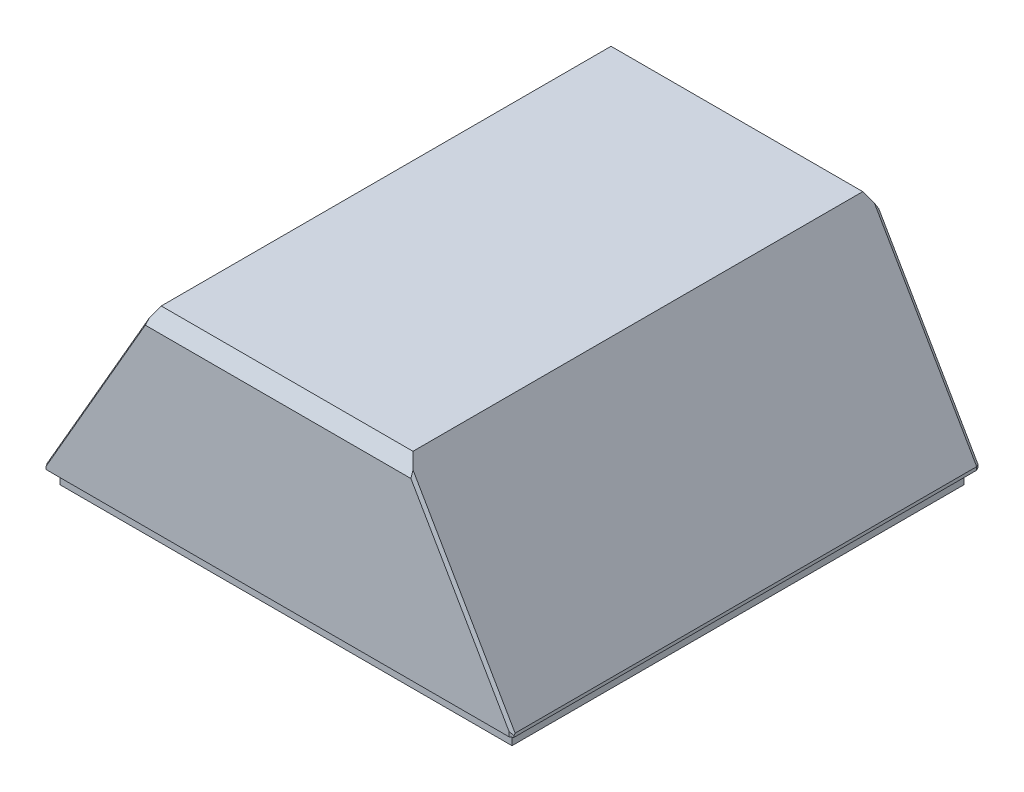
ISO-10303-21;
HEADER;
FILE_DESCRIPTION(('STEP AP214'),'2;1');
FILE_NAME('part.step','',(''),(''),'','','');
FILE_SCHEMA(('AUTOMOTIVE_DESIGN { 1 0 10303 214 1 1 1 1 }'));
ENDSEC;
DATA;
#1=APPLICATION_CONTEXT('core data for automotive mechanical design processes');
#2=APPLICATION_PROTOCOL_DEFINITION('international standard','automotive_design',2000,#1);
#3=PRODUCT_CONTEXT('',#1,'mechanical');
#4=PRODUCT('Part','Part','',(#3));
#5=PRODUCT_RELATED_PRODUCT_CATEGORY('part','',(#4));
#6=PRODUCT_DEFINITION_FORMATION('','',#4);
#7=PRODUCT_DEFINITION_CONTEXT('part definition',#1,'design');
#8=PRODUCT_DEFINITION('design','',#6,#7);
#9=PRODUCT_DEFINITION_SHAPE('','',#8);
#10=(LENGTH_UNIT() NAMED_UNIT(*) SI_UNIT(.MILLI.,.METRE.));
#11=(NAMED_UNIT(*) PLANE_ANGLE_UNIT() SI_UNIT($,.RADIAN.));
#12=(NAMED_UNIT(*) SI_UNIT($,.STERADIAN.) SOLID_ANGLE_UNIT());
#13=UNCERTAINTY_MEASURE_WITH_UNIT(LENGTH_MEASURE(1.E-05),#10,'distance_accuracy_value','');
#14=(GEOMETRIC_REPRESENTATION_CONTEXT(3) GLOBAL_UNCERTAINTY_ASSIGNED_CONTEXT((#13)) GLOBAL_UNIT_ASSIGNED_CONTEXT((#10,
#11,#12)) REPRESENTATION_CONTEXT('',''));
#15=CARTESIAN_POINT('',(0.,0.,0.));
#16=DIRECTION('',(0.,0.,1.));
#17=DIRECTION('',(1.,0.,0.));
#18=AXIS2_PLACEMENT_3D('',#15,#16,#17);
#19=CARTESIAN_POINT('',(75.,1.,75.));
#20=DIRECTION('',(-1.,0.,0.));
#21=DIRECTION('',(0.,0.,1.));
#22=AXIS2_PLACEMENT_3D('',#19,#20,#21);
#23=PLANE('',#22);
#24=DIRECTION('',(0.,0.,1.));
#25=VECTOR('',#24,1.);
#26=CARTESIAN_POINT('',(75.,0.999999999999585,75.));
#27=LINE('',#26,#25);
#28=CARTESIAN_POINT('',(75.,0.999999999999585,-74.));
#29=VERTEX_POINT('',#28);
#30=CARTESIAN_POINT('',(75.,0.999999999999585,74.));
#31=VERTEX_POINT('',#30);
#32=EDGE_CURVE('E223',#29,#31,#27,.T.);
#33=ORIENTED_EDGE('',*,*,#32,.T.);
#34=DIRECTION('',(0.,0.755928946018454,-0.654653670707978));
#35=VECTOR('',#34,1.);
#36=CARTESIAN_POINT('',(75.,37.4555455688303,42.4285714285714));
#37=LINE('',#36,#35);
#38=CARTESIAN_POINT('',(75.,0.511966128287018,74.4226497308104));
#39=VERTEX_POINT('',#38);
#40=EDGE_CURVE('E350',#31,#39,#37,.F.);
#41=ORIENTED_EDGE('',*,*,#40,.T.);
#42=DIRECTION('',(0.,-1.,0.));
#43=VECTOR('',#42,1.);
#44=CARTESIAN_POINT('',(75.,1.,74.4226497308104));
#45=LINE('',#44,#43);
#46=CARTESIAN_POINT('',(75.,0.,74.4226497308104));
#47=VERTEX_POINT('',#46);
#48=EDGE_CURVE('E294',#39,#47,#45,.T.);
#49=ORIENTED_EDGE('',*,*,#48,.T.);
#50=DIRECTION('',(0.,0.,-1.));
#51=VECTOR('',#50,1.);
#52=CARTESIAN_POINT('',(75.,0.,75.));
#53=LINE('',#52,#51);
#54=CARTESIAN_POINT('',(75.,0.,-74.));
#55=VERTEX_POINT('',#54);
#56=EDGE_CURVE('E193',#47,#55,#53,.T.);
#57=ORIENTED_EDGE('',*,*,#56,.T.);
#58=DIRECTION('',(0.,1.,0.));
#59=VECTOR('',#58,1.);
#60=CARTESIAN_POINT('',(75.,1.,-74.));
#61=LINE('',#60,#59);
#62=EDGE_CURVE('E297',#55,#29,#61,.T.);
#63=ORIENTED_EDGE('',*,*,#62,.T.);
#64=EDGE_LOOP('',(#33,#41,#49,#57,#63));
#65=FACE_BOUND('',#64,.T.);
#66=ADVANCED_FACE('F39',(#65),#23,.F.);
#67=CARTESIAN_POINT('',(-75.,1.,-75.));
#68=DIRECTION('',(0.,0.,1.));
#69=DIRECTION('',(1.,0.,0.));
#70=AXIS2_PLACEMENT_3D('',#67,#68,#69);
#71=PLANE('',#70);
#72=DIRECTION('',(0.,1.,0.));
#73=VECTOR('',#72,1.);
#74=CARTESIAN_POINT('',(-74.,1.,-75.));
#75=LINE('',#74,#73);
#76=CARTESIAN_POINT('',(-74.,0.,-75.));
#77=VERTEX_POINT('',#76);
#78=CARTESIAN_POINT('',(-74.,1.57735026918919,-75.));
#79=VERTEX_POINT('',#78);
#80=EDGE_CURVE('E290',#77,#79,#75,.T.);
#81=ORIENTED_EDGE('',*,*,#80,.T.);
#82=DIRECTION('',(0.499999999999998,0.86602540378444,0.));
#83=VECTOR('',#82,1.);
#84=CARTESIAN_POINT('',(-42.7457351945705,55.7113248654052,-75.));
#85=LINE('',#84,#83);
#86=CARTESIAN_POINT('',(-42.5790685279039,56.,-75.));
#87=VERTEX_POINT('',#86);
#88=EDGE_CURVE('E305',#79,#87,#85,.T.);
#89=ORIENTED_EDGE('',*,*,#88,.T.);
#90=DIRECTION('',(1.,0.,0.));
#91=VECTOR('',#90,1.);
#92=CARTESIAN_POINT('',(-75.,56.,-75.));
#93=LINE('',#92,#91);
#94=CARTESIAN_POINT('',(42.5790685279039,56.,-75.));
#95=VERTEX_POINT('',#94);
#96=EDGE_CURVE('E246',#87,#95,#93,.T.);
#97=ORIENTED_EDGE('',*,*,#96,.T.);
#98=DIRECTION('',(0.499999999999998,-0.86602540378444,0.));
#99=VECTOR('',#98,1.);
#100=CARTESIAN_POINT('',(73.9226497308104,1.71132486540478,-75.));
#101=LINE('',#100,#99);
#102=CARTESIAN_POINT('',(74.4226497308104,0.845299461620388,-75.));
#103=VERTEX_POINT('',#102);
#104=EDGE_CURVE('E301',#95,#103,#101,.T.);
#105=ORIENTED_EDGE('',*,*,#104,.T.);
#106=DIRECTION('',(0.,-1.,0.));
#107=VECTOR('',#106,1.);
#108=CARTESIAN_POINT('',(74.4226497308104,1.,-75.));
#109=LINE('',#108,#107);
#110=CARTESIAN_POINT('',(74.4226497308104,0.,-75.));
#111=VERTEX_POINT('',#110);
#112=EDGE_CURVE('E287',#103,#111,#109,.T.);
#113=ORIENTED_EDGE('',*,*,#112,.T.);
#114=DIRECTION('',(-1.,0.,0.));
#115=VECTOR('',#114,1.);
#116=CARTESIAN_POINT('',(-75.,0.,-75.));
#117=LINE('',#116,#115);
#118=EDGE_CURVE('E198',#111,#77,#117,.T.);
#119=ORIENTED_EDGE('',*,*,#118,.T.);
#120=EDGE_LOOP('',(#81,#89,#97,#105,#113,#119));
#121=FACE_BOUND('',#120,.T.);
#122=ADVANCED_FACE('F422',(#121),#71,.F.);
#123=CARTESIAN_POINT('',(-75.,1.,75.));
#124=DIRECTION('',(1.,0.,0.));
#125=DIRECTION('',(0.,0.,-1.));
#126=AXIS2_PLACEMENT_3D('',#123,#124,#125);
#127=PLANE('',#126);
#128=DIRECTION('',(0.,0.,-1.));
#129=VECTOR('',#128,1.);
#130=CARTESIAN_POINT('',(-75.,0.999999999999585,75.));
#131=LINE('',#130,#129);
#132=CARTESIAN_POINT('',(-75.,0.999999999999585,74.));
#133=VERTEX_POINT('',#132);
#134=CARTESIAN_POINT('',(-75.,0.999999999999585,-74.));
#135=VERTEX_POINT('',#134);
#136=EDGE_CURVE('E227',#133,#135,#131,.T.);
#137=ORIENTED_EDGE('',*,*,#136,.T.);
#138=DIRECTION('',(0.,0.755928946018463,0.654653670707967));
#139=VECTOR('',#138,1.);
#140=CARTESIAN_POINT('',(-75.,0.340171120925897,-74.5714285714284));
#141=LINE('',#140,#139);
#142=CARTESIAN_POINT('',(-75.,0.511966128286974,-74.4226497308104));
#143=VERTEX_POINT('',#142);
#144=EDGE_CURVE('E321',#135,#143,#141,.F.);
#145=ORIENTED_EDGE('',*,*,#144,.T.);
#146=DIRECTION('',(0.,-1.,0.));
#147=VECTOR('',#146,1.);
#148=CARTESIAN_POINT('',(-75.,1.,-74.4226497308104));
#149=LINE('',#148,#147);
#150=CARTESIAN_POINT('',(-75.,0.,-74.4226497308104));
#151=VERTEX_POINT('',#150);
#152=EDGE_CURVE('E280',#143,#151,#149,.T.);
#153=ORIENTED_EDGE('',*,*,#152,.T.);
#154=DIRECTION('',(0.,0.,1.));
#155=VECTOR('',#154,1.);
#156=CARTESIAN_POINT('',(-75.,0.,75.));
#157=LINE('',#156,#155);
#158=CARTESIAN_POINT('',(-75.,0.,74.));
#159=VERTEX_POINT('',#158);
#160=EDGE_CURVE('E207',#151,#159,#157,.T.);
#161=ORIENTED_EDGE('',*,*,#160,.T.);
#162=DIRECTION('',(0.,1.,0.));
#163=VECTOR('',#162,1.);
#164=CARTESIAN_POINT('',(-75.,1.,74.));
#165=LINE('',#164,#163);
#166=EDGE_CURVE('E283',#159,#133,#165,.T.);
#167=ORIENTED_EDGE('',*,*,#166,.T.);
#168=EDGE_LOOP('',(#137,#145,#153,#161,#167));
#169=FACE_BOUND('',#168,.T.);
#170=ADVANCED_FACE('F395',(#169),#127,.F.);
#171=CARTESIAN_POINT('',(-75.,1.,75.));
#172=DIRECTION('',(0.,0.,-1.));
#173=DIRECTION('',(-1.,0.,0.));
#174=AXIS2_PLACEMENT_3D('',#171,#172,#173);
#175=PLANE('',#174);
#176=DIRECTION('',(0.,1.,0.));
#177=VECTOR('',#176,1.);
#178=CARTESIAN_POINT('',(74.,1.,75.));
#179=LINE('',#178,#177);
#180=CARTESIAN_POINT('',(74.,0.,75.));
#181=VERTEX_POINT('',#180);
#182=CARTESIAN_POINT('',(74.,1.57735026918923,75.));
#183=VERTEX_POINT('',#182);
#184=EDGE_CURVE('E261',#181,#183,#179,.T.);
#185=ORIENTED_EDGE('',*,*,#184,.T.);
#186=DIRECTION('',(-0.499999999999998,0.86602540378444,0.));
#187=VECTOR('',#186,1.);
#188=CARTESIAN_POINT('',(42.7457351945705,55.7113248654052,75.));
#189=LINE('',#188,#187);
#190=CARTESIAN_POINT('',(42.5790685279039,56.,75.));
#191=VERTEX_POINT('',#190);
#192=EDGE_CURVE('E340',#183,#191,#189,.T.);
#193=ORIENTED_EDGE('',*,*,#192,.T.);
#194=DIRECTION('',(-1.,0.,0.));
#195=VECTOR('',#194,1.);
#196=CARTESIAN_POINT('',(-75.,56.,75.));
#197=LINE('',#196,#195);
#198=CARTESIAN_POINT('',(-42.5790685279039,56.,75.));
#199=VERTEX_POINT('',#198);
#200=EDGE_CURVE('E257',#191,#199,#197,.T.);
#201=ORIENTED_EDGE('',*,*,#200,.T.);
#202=DIRECTION('',(-0.499999999999998,-0.86602540378444,0.));
#203=VECTOR('',#202,1.);
#204=CARTESIAN_POINT('',(-73.9226497308104,1.71132486540479,75.));
#205=LINE('',#204,#203);
#206=CARTESIAN_POINT('',(-74.4226497308104,0.845299461620343,75.));
#207=VERTEX_POINT('',#206);
#208=EDGE_CURVE('E336',#199,#207,#205,.T.);
#209=ORIENTED_EDGE('',*,*,#208,.T.);
#210=DIRECTION('',(0.,-1.,0.));
#211=VECTOR('',#210,1.);
#212=CARTESIAN_POINT('',(-74.4226497308104,1.,75.));
#213=LINE('',#212,#211);
#214=CARTESIAN_POINT('',(-74.4226497308104,0.,75.));
#215=VERTEX_POINT('',#214);
#216=EDGE_CURVE('E265',#207,#215,#213,.T.);
#217=ORIENTED_EDGE('',*,*,#216,.T.);
#218=DIRECTION('',(1.,0.,0.));
#219=VECTOR('',#218,1.);
#220=CARTESIAN_POINT('',(-75.,0.,75.));
#221=LINE('',#220,#219);
#222=EDGE_CURVE('E211',#215,#181,#221,.T.);
#223=ORIENTED_EDGE('',*,*,#222,.T.);
#224=EDGE_LOOP('',(#185,#193,#201,#209,#217,#223));
#225=FACE_BOUND('',#224,.T.);
#226=ADVANCED_FACE('F363',(#225),#175,.F.);
#227=CARTESIAN_POINT('',(0.,0.,0.));
#228=DIRECTION('',(0.,-1.,0.));
#229=DIRECTION('',(0.,0.,-1.));
#230=AXIS2_PLACEMENT_3D('',#227,#228,#229);
#231=PLANE('',#230);
#232=DIRECTION('',(0.,0.,1.));
#233=VECTOR('',#232,1.);
#234=CARTESIAN_POINT('',(72.5,0.,-72.5));
#235=LINE('',#234,#233);
#236=CARTESIAN_POINT('',(72.5,0.,-72.5));
#237=VERTEX_POINT('',#236);
#238=CARTESIAN_POINT('',(72.5,0.,72.5));
#239=VERTEX_POINT('',#238);
#240=EDGE_CURVE('E55',#237,#239,#235,.T.);
#241=ORIENTED_EDGE('',*,*,#240,.F.);
#242=DIRECTION('',(1.,0.,0.));
#243=VECTOR('',#242,1.);
#244=CARTESIAN_POINT('',(-72.5,0.,-72.5));
#245=LINE('',#244,#243);
#246=CARTESIAN_POINT('',(-72.5,0.,-72.5));
#247=VERTEX_POINT('',#246);
#248=EDGE_CURVE('E59',#247,#237,#245,.T.);
#249=ORIENTED_EDGE('',*,*,#248,.F.);
#250=DIRECTION('',(0.,0.,-1.));
#251=VECTOR('',#250,1.);
#252=CARTESIAN_POINT('',(-72.5,0.,-72.5));
#253=LINE('',#252,#251);
#254=CARTESIAN_POINT('',(-72.5,0.,72.5));
#255=VERTEX_POINT('',#254);
#256=EDGE_CURVE('E629',#255,#247,#253,.T.);
#257=ORIENTED_EDGE('',*,*,#256,.F.);
#258=DIRECTION('',(-1.,0.,0.));
#259=VECTOR('',#258,1.);
#260=CARTESIAN_POINT('',(-72.5,0.,72.5));
#261=LINE('',#260,#259);
#262=EDGE_CURVE('E639',#239,#255,#261,.T.);
#263=ORIENTED_EDGE('',*,*,#262,.F.);
#264=EDGE_LOOP('',(#241,#249,#257,#263));
#265=FACE_BOUND('',#264,.T.);
#266=ORIENTED_EDGE('',*,*,#222,.F.);
#267=DIRECTION('',(0.500000000000005,0.,0.866025403784436));
#268=VECTOR('',#267,1.);
#269=CARTESIAN_POINT('',(-88.2929399400241,0.,50.975952641917));
#270=LINE('',#269,#268);
#271=EDGE_CURVE('E277',#215,#159,#270,.F.);
#272=ORIENTED_EDGE('',*,*,#271,.T.);
#273=ORIENTED_EDGE('',*,*,#160,.F.);
#274=DIRECTION('',(-0.866025403784441,0.,0.499999999999996));
#275=VECTOR('',#274,1.);
#276=CARTESIAN_POINT('',(-50.9759526419159,0.,-88.2929399400244));
#277=LINE('',#276,#275);
#278=EDGE_CURVE('E274',#151,#77,#277,.F.);
#279=ORIENTED_EDGE('',*,*,#278,.T.);
#280=ORIENTED_EDGE('',*,*,#118,.F.);
#281=DIRECTION('',(-0.499999999999996,0.,-0.866025403784441));
#282=VECTOR('',#281,1.);
#283=CARTESIAN_POINT('',(88.2929399400244,0.,-50.9759526419159));
#284=LINE('',#283,#282);
#285=EDGE_CURVE('E271',#111,#55,#284,.F.);
#286=ORIENTED_EDGE('',*,*,#285,.T.);
#287=ORIENTED_EDGE('',*,*,#56,.F.);
#288=DIRECTION('',(0.866025403784436,0.,-0.500000000000005));
#289=VECTOR('',#288,1.);
#290=CARTESIAN_POINT('',(50.975952641917,0.,88.2929399400241));
#291=LINE('',#290,#289);
#292=EDGE_CURVE('E268',#47,#181,#291,.F.);
#293=ORIENTED_EDGE('',*,*,#292,.T.);
#294=EDGE_LOOP('',(#266,#272,#273,#279,#280,#286,#287,#293));
#295=FACE_BOUND('',#294,.T.);
#296=ADVANCED_FACE('F403',(#265,#295),#231,.T.);
#297=CARTESIAN_POINT('',(0.,61.,0.));
#298=DIRECTION('',(0.,-1.,0.));
#299=DIRECTION('',(0.,0.,-1.));
#300=AXIS2_PLACEMENT_3D('',#297,#298,#299);
#301=PLANE('',#300);
#302=DIRECTION('',(0.,0.,-1.));
#303=VECTOR('',#302,1.);
#304=CARTESIAN_POINT('',(40.3589838486224,61.,0.));
#305=LINE('',#304,#303);
#306=CARTESIAN_POINT('',(40.3589838486224,61.,72.1132486540519));
#307=VERTEX_POINT('',#306);
#308=CARTESIAN_POINT('',(40.3589838486224,61.,-72.1132486540519));
#309=VERTEX_POINT('',#308);
#310=EDGE_CURVE('E219',#307,#309,#305,.T.);
#311=ORIENTED_EDGE('',*,*,#310,.T.);
#312=DIRECTION('',(-1.,0.,0.));
#313=VECTOR('',#312,1.);
#314=CARTESIAN_POINT('',(0.,61.,-72.1132486540519));
#315=LINE('',#314,#313);
#316=CARTESIAN_POINT('',(-40.3589838486224,61.,-72.1132486540519));
#317=VERTEX_POINT('',#316);
#318=EDGE_CURVE('E235',#309,#317,#315,.T.);
#319=ORIENTED_EDGE('',*,*,#318,.T.);
#320=DIRECTION('',(0.,0.,1.));
#321=VECTOR('',#320,1.);
#322=CARTESIAN_POINT('',(-40.3589838486224,61.,0.));
#323=LINE('',#322,#321);
#324=CARTESIAN_POINT('',(-40.3589838486224,61.,72.1132486540519));
#325=VERTEX_POINT('',#324);
#326=EDGE_CURVE('E215',#317,#325,#323,.T.);
#327=ORIENTED_EDGE('',*,*,#326,.T.);
#328=DIRECTION('',(1.,0.,0.));
#329=VECTOR('',#328,1.);
#330=CARTESIAN_POINT('',(0.,61.,72.1132486540519));
#331=LINE('',#330,#329);
#332=EDGE_CURVE('E231',#325,#307,#331,.T.);
#333=ORIENTED_EDGE('',*,*,#332,.T.);
#334=EDGE_LOOP('',(#311,#319,#327,#333));
#335=FACE_BOUND('',#334,.T.);
#336=ADVANCED_FACE('F378',(#335),#301,.F.);
#337=CARTESIAN_POINT('',(40.3589838486224,61.,0.));
#338=DIRECTION('',(-0.86602540378444,-0.499999999999998,0.));
#339=DIRECTION('',(0.,0.,-1.));
#340=AXIS2_PLACEMENT_3D('',#337,#338,#339);
#341=PLANE('',#340);
#342=ORIENTED_EDGE('',*,*,#32,.F.);
#343=DIRECTION('',(0.499999999999998,-0.86602540378444,0.));
#344=VECTOR('',#343,1.);
#345=CARTESIAN_POINT('',(43.2457351945705,56.,-74.0000000000001));
#346=LINE('',#345,#344);
#347=CARTESIAN_POINT('',(42.2457351945706,57.7320508075687,-74.0000000000001));
#348=VERTEX_POINT('',#347);
#349=EDGE_CURVE('E333',#29,#348,#346,.F.);
#350=ORIENTED_EDGE('',*,*,#349,.T.);
#351=DIRECTION('',(-0.447213595499956,0.774596669241485,0.447213595499957));
#352=VECTOR('',#351,1.);
#353=CARTESIAN_POINT('',(25.9363341178121,85.9807621135332,-57.6905989232415));
#354=LINE('',#353,#352);
#355=EDGE_CURVE('E254',#348,#309,#354,.T.);
#356=ORIENTED_EDGE('',*,*,#355,.T.);
#357=ORIENTED_EDGE('',*,*,#310,.F.);
#358=DIRECTION('',(0.447213595499956,-0.774596669241485,0.447213595499957));
#359=VECTOR('',#358,1.);
#360=CARTESIAN_POINT('',(25.9363341178121,85.9807621135332,57.6905989232415));
#361=LINE('',#360,#359);
#362=CARTESIAN_POINT('',(42.2457351945706,57.7320508075688,74.));
#363=VERTEX_POINT('',#362);
#364=EDGE_CURVE('E250',#307,#363,#361,.T.);
#365=ORIENTED_EDGE('',*,*,#364,.T.);
#366=DIRECTION('',(-0.499999999999998,0.86602540378444,0.));
#367=VECTOR('',#366,1.);
#368=CARTESIAN_POINT('',(74.,2.73205080756846,74.));
#369=LINE('',#368,#367);
#370=EDGE_CURVE('E330',#363,#31,#369,.F.);
#371=ORIENTED_EDGE('',*,*,#370,.T.);
#372=EDGE_LOOP('',(#342,#350,#356,#357,#365,#371));
#373=FACE_BOUND('',#372,.T.);
#374=ADVANCED_FACE('F374',(#373),#341,.F.);
#375=CARTESIAN_POINT('',(-40.3589838486224,61.,0.));
#376=DIRECTION('',(0.86602540378444,-0.499999999999998,0.));
#377=DIRECTION('',(0.,0.,1.));
#378=AXIS2_PLACEMENT_3D('',#375,#376,#377);
#379=PLANE('',#378);
#380=DIRECTION('',(-0.447213595499956,-0.774596669241485,-0.447213595499957));
#381=VECTOR('',#380,1.);
#382=CARTESIAN_POINT('',(-25.9363341178121,85.9807621135332,-57.6905989232415));
#383=LINE('',#382,#381);
#384=CARTESIAN_POINT('',(-42.2457351945706,57.7320508075688,-74.));
#385=VERTEX_POINT('',#384);
#386=EDGE_CURVE('E242',#317,#385,#383,.T.);
#387=ORIENTED_EDGE('',*,*,#386,.T.);
#388=DIRECTION('',(0.499999999999998,0.86602540378444,0.));
#389=VECTOR('',#388,1.);
#390=CARTESIAN_POINT('',(-74.,2.73205080756846,-74.));
#391=LINE('',#390,#389);
#392=EDGE_CURVE('E318',#385,#135,#391,.F.);
#393=ORIENTED_EDGE('',*,*,#392,.T.);
#394=ORIENTED_EDGE('',*,*,#136,.F.);
#395=DIRECTION('',(-0.499999999999998,-0.86602540378444,0.));
#396=VECTOR('',#395,1.);
#397=CARTESIAN_POINT('',(-43.2457351945705,56.,74.));
#398=LINE('',#397,#396);
#399=CARTESIAN_POINT('',(-42.2457351945705,57.7320508075689,74.));
#400=VERTEX_POINT('',#399);
#401=EDGE_CURVE('E315',#133,#400,#398,.F.);
#402=ORIENTED_EDGE('',*,*,#401,.T.);
#403=DIRECTION('',(0.447213595499956,0.774596669241485,-0.447213595499957));
#404=VECTOR('',#403,1.);
#405=CARTESIAN_POINT('',(-25.9363341178121,85.9807621135332,57.6905989232415));
#406=LINE('',#405,#404);
#407=EDGE_CURVE('E239',#400,#325,#406,.T.);
#408=ORIENTED_EDGE('',*,*,#407,.T.);
#409=ORIENTED_EDGE('',*,*,#326,.F.);
#410=EDGE_LOOP('',(#387,#393,#394,#402,#408,#409));
#411=FACE_BOUND('',#410,.T.);
#412=ADVANCED_FACE('F386',(#411),#379,.F.);
#413=CARTESIAN_POINT('',(0.,61.,-72.1132486540519));
#414=DIRECTION('',(0.,-0.499999999999999,0.866025403784439));
#415=DIRECTION('',(-1.,0.,0.));
#416=AXIS2_PLACEMENT_3D('',#413,#414,#415);
#417=PLANE('',#416);
#418=ORIENTED_EDGE('',*,*,#96,.F.);
#419=DIRECTION('',(0.164398987305349,0.854242196177251,0.493196961916071));
#420=VECTOR('',#419,1.);
#421=CARTESIAN_POINT('',(-40.4920392122478,66.8445224348067,-68.7389120530314));
#422=LINE('',#421,#420);
#423=EDGE_CURVE('E312',#87,#385,#422,.T.);
#424=ORIENTED_EDGE('',*,*,#423,.T.);
#425=ORIENTED_EDGE('',*,*,#386,.F.);
#426=ORIENTED_EDGE('',*,*,#318,.F.);
#427=ORIENTED_EDGE('',*,*,#355,.F.);
#428=DIRECTION('',(0.164398987305351,-0.854242196177251,-0.493196961916071));
#429=VECTOR('',#428,1.);
#430=CARTESIAN_POINT('',(40.4920392122478,66.8445224348068,-68.7389120530314));
#431=LINE('',#430,#429);
#432=EDGE_CURVE('E309',#348,#95,#431,.T.);
#433=ORIENTED_EDGE('',*,*,#432,.T.);
#434=EDGE_LOOP('',(#418,#424,#425,#426,#427,#433));
#435=FACE_BOUND('',#434,.T.);
#436=ADVANCED_FACE('F382',(#435),#417,.F.);
#437=CARTESIAN_POINT('',(0.,61.,72.1132486540519));
#438=DIRECTION('',(0.,-0.499999999999999,-0.866025403784439));
#439=DIRECTION('',(1.,0.,0.));
#440=AXIS2_PLACEMENT_3D('',#437,#438,#439);
#441=PLANE('',#440);
#442=ORIENTED_EDGE('',*,*,#200,.F.);
#443=DIRECTION('',(-0.164398987305358,0.85424219617725,-0.493196961916071));
#444=VECTOR('',#443,1.);
#445=CARTESIAN_POINT('',(40.4920392122476,66.844522434807,68.7389120530312));
#446=LINE('',#445,#444);
#447=EDGE_CURVE('E347',#191,#363,#446,.T.);
#448=ORIENTED_EDGE('',*,*,#447,.T.);
#449=ORIENTED_EDGE('',*,*,#364,.F.);
#450=ORIENTED_EDGE('',*,*,#332,.F.);
#451=ORIENTED_EDGE('',*,*,#407,.F.);
#452=DIRECTION('',(-0.164398987305356,-0.85424219617725,0.493196961916071));
#453=VECTOR('',#452,1.);
#454=CARTESIAN_POINT('',(-40.4920392122476,66.844522434807,68.7389120530312));
#455=LINE('',#454,#453);
#456=EDGE_CURVE('E344',#400,#199,#455,.T.);
#457=ORIENTED_EDGE('',*,*,#456,.T.);
#458=EDGE_LOOP('',(#442,#448,#449,#450,#451,#457));
#459=FACE_BOUND('',#458,.T.);
#460=ADVANCED_FACE('F369',(#459),#441,.F.);
#461=CARTESIAN_POINT('',(-74.4226497308104,1.,75.));
#462=DIRECTION('',(0.866025403784436,0.,-0.500000000000004));
#463=DIRECTION('',(0.,-1.,0.));
#464=AXIS2_PLACEMENT_3D('',#461,#462,#463);
#465=PLANE('',#464);
#466=ORIENTED_EDGE('',*,*,#216,.F.);
#467=DIRECTION('',(-0.495572219835084,0.132788176096097,-0.858356263574047));
#468=VECTOR('',#467,1.);
#469=CARTESIAN_POINT('',(-74.432829974735,0.84802724975871,74.982367300289));
#470=LINE('',#469,#468);
#471=EDGE_CURVE('E11',#207,#133,#470,.T.);
#472=ORIENTED_EDGE('',*,*,#471,.T.);
#473=ORIENTED_EDGE('',*,*,#166,.F.);
#474=ORIENTED_EDGE('',*,*,#271,.F.);
#475=EDGE_LOOP('',(#466,#472,#473,#474));
#476=FACE_BOUND('',#475,.T.);
#477=ADVANCED_FACE('F408',(#476),#465,.F.);
#478=CARTESIAN_POINT('',(-75.,1.,-74.4226497308104));
#479=DIRECTION('',(0.499999999999996,0.,0.866025403784441));
#480=DIRECTION('',(0.,-1.,0.));
#481=AXIS2_PLACEMENT_3D('',#478,#479,#480);
#482=PLANE('',#481);
#483=ORIENTED_EDGE('',*,*,#152,.F.);
#484=DIRECTION('',(0.636493951193922,0.67811056138219,-0.367479954059375));
#485=VECTOR('',#484,1.);
#486=CARTESIAN_POINT('',(-74.7893581044856,0.736380663177545,-74.5442638858882));
#487=LINE('',#486,#485);
#488=EDGE_CURVE('E324',#143,#79,#487,.T.);
#489=ORIENTED_EDGE('',*,*,#488,.T.);
#490=ORIENTED_EDGE('',*,*,#80,.F.);
#491=ORIENTED_EDGE('',*,*,#278,.F.);
#492=EDGE_LOOP('',(#483,#489,#490,#491));
#493=FACE_BOUND('',#492,.T.);
#494=ADVANCED_FACE('F398',(#493),#482,.F.);
#495=CARTESIAN_POINT('',(74.4226497308104,1.,-75.));
#496=DIRECTION('',(-0.866025403784441,0.,0.499999999999996));
#497=DIRECTION('',(0.,-1.,0.));
#498=AXIS2_PLACEMENT_3D('',#495,#496,#497);
#499=PLANE('',#498);
#500=ORIENTED_EDGE('',*,*,#112,.F.);
#501=DIRECTION('',(0.495572219835072,0.132788176096135,0.858356263574048));
#502=VECTOR('',#501,1.);
#503=CARTESIAN_POINT('',(74.432829974735,0.848027249758743,-74.982367300289));
#504=LINE('',#503,#502);
#505=EDGE_CURVE('E327',#103,#29,#504,.T.);
#506=ORIENTED_EDGE('',*,*,#505,.T.);
#507=ORIENTED_EDGE('',*,*,#62,.F.);
#508=ORIENTED_EDGE('',*,*,#285,.F.);
#509=EDGE_LOOP('',(#500,#506,#507,#508));
#510=FACE_BOUND('',#509,.T.);
#511=ADVANCED_FACE('F444',(#510),#499,.F.);
#512=CARTESIAN_POINT('',(75.,1.,74.4226497308104));
#513=DIRECTION('',(-0.500000000000004,0.,-0.866025403784436));
#514=DIRECTION('',(0.,-1.,0.));
#515=AXIS2_PLACEMENT_3D('',#512,#513,#514);
#516=PLANE('',#515);
#517=ORIENTED_EDGE('',*,*,#48,.F.);
#518=DIRECTION('',(-0.636493951193919,0.678110561382189,0.367479954059382));
#519=VECTOR('',#518,1.);
#520=CARTESIAN_POINT('',(74.7893581044857,0.736380663177568,74.5442638858882));
#521=LINE('',#520,#519);
#522=EDGE_CURVE('E48',#39,#183,#521,.T.);
#523=ORIENTED_EDGE('',*,*,#522,.T.);
#524=ORIENTED_EDGE('',*,*,#184,.F.);
#525=ORIENTED_EDGE('',*,*,#292,.F.);
#526=EDGE_LOOP('',(#517,#523,#524,#525));
#527=FACE_BOUND('',#526,.T.);
#528=ADVANCED_FACE('F357',(#527),#516,.F.);
#529=CARTESIAN_POINT('',(-74.4999999999998,0.711324865405077,-75.));
#530=DIRECTION('',(0.749999999999997,-0.433012701892215,0.500000000000009));
#531=DIRECTION('',(0.499999999999998,0.86602540378444,0.));
#532=AXIS2_PLACEMENT_3D('',#529,#530,#531);
#533=PLANE('',#532);
#534=ORIENTED_EDGE('',*,*,#144,.F.);
#535=ORIENTED_EDGE('',*,*,#392,.F.);
#536=ORIENTED_EDGE('',*,*,#423,.F.);
#537=ORIENTED_EDGE('',*,*,#88,.F.);
#538=ORIENTED_EDGE('',*,*,#488,.F.);
#539=EDGE_LOOP('',(#534,#535,#536,#537,#538));
#540=FACE_BOUND('',#539,.T.);
#541=ADVANCED_FACE('F390',(#540),#533,.F.);
#542=CARTESIAN_POINT('',(37.0000000000002,65.6632301492378,-75.));
#543=DIRECTION('',(-0.749999999999998,-0.433012701892216,0.500000000000006));
#544=DIRECTION('',(0.499999999999998,-0.86602540378444,0.));
#545=AXIS2_PLACEMENT_3D('',#542,#543,#544);
#546=PLANE('',#545);
#547=ORIENTED_EDGE('',*,*,#432,.F.);
#548=ORIENTED_EDGE('',*,*,#349,.F.);
#549=ORIENTED_EDGE('',*,*,#505,.F.);
#550=ORIENTED_EDGE('',*,*,#104,.F.);
#551=EDGE_LOOP('',(#547,#548,#549,#550));
#552=FACE_BOUND('',#551,.T.);
#553=ADVANCED_FACE('F420',(#552),#546,.F.);
#554=CARTESIAN_POINT('',(37.0000000000001,65.6632301492378,75.));
#555=DIRECTION('',(-0.750000000000002,-0.433012701892218,-0.499999999999998));
#556=DIRECTION('',(-0.499999999999998,0.86602540378444,0.));
#557=AXIS2_PLACEMENT_3D('',#554,#555,#556);
#558=PLANE('',#557);
#559=ORIENTED_EDGE('',*,*,#40,.F.);
#560=ORIENTED_EDGE('',*,*,#370,.F.);
#561=ORIENTED_EDGE('',*,*,#447,.F.);
#562=ORIENTED_EDGE('',*,*,#192,.F.);
#563=ORIENTED_EDGE('',*,*,#522,.F.);
#564=EDGE_LOOP('',(#559,#560,#561,#562,#563));
#565=FACE_BOUND('',#564,.T.);
#566=ADVANCED_FACE('F366',(#565),#558,.F.);
#567=CARTESIAN_POINT('',(-74.4999999999998,0.711324865405081,75.));
#568=DIRECTION('',(0.750000000000001,-0.433012701892218,-0.5));
#569=DIRECTION('',(-0.499999999999998,-0.86602540378444,0.));
#570=AXIS2_PLACEMENT_3D('',#567,#568,#569);
#571=PLANE('',#570);
#572=ORIENTED_EDGE('',*,*,#456,.F.);
#573=ORIENTED_EDGE('',*,*,#401,.F.);
#574=ORIENTED_EDGE('',*,*,#471,.F.);
#575=ORIENTED_EDGE('',*,*,#208,.F.);
#576=EDGE_LOOP('',(#572,#573,#574,#575));
#577=FACE_BOUND('',#576,.T.);
#578=ADVANCED_FACE('F41',(#577),#571,.F.);
#579=CARTESIAN_POINT('',(72.5,-4.5,-72.5));
#580=DIRECTION('',(-1.,0.,0.));
#581=DIRECTION('',(0.,0.,1.));
#582=AXIS2_PLACEMENT_3D('',#579,#580,#581);
#583=PLANE('',#582);
#584=ORIENTED_EDGE('',*,*,#240,.T.);
#585=DIRECTION('',(0.,1.,0.));
#586=VECTOR('',#585,1.);
#587=CARTESIAN_POINT('',(72.5,-4.5,72.5));
#588=LINE('',#587,#586);
#589=CARTESIAN_POINT('',(72.5,-4.5,72.5));
#590=VERTEX_POINT('',#589);
#591=EDGE_CURVE('E173',#590,#239,#588,.T.);
#592=ORIENTED_EDGE('',*,*,#591,.F.);
#593=DIRECTION('',(0.,0.,1.));
#594=VECTOR('',#593,1.);
#595=CARTESIAN_POINT('',(72.5,-4.5,-72.5));
#596=LINE('',#595,#594);
#597=CARTESIAN_POINT('',(72.5,-4.5,-72.5));
#598=VERTEX_POINT('',#597);
#599=EDGE_CURVE('E180',#598,#590,#596,.T.);
#600=ORIENTED_EDGE('',*,*,#599,.F.);
#601=DIRECTION('',(0.,1.,0.));
#602=VECTOR('',#601,1.);
#603=CARTESIAN_POINT('',(72.5,-4.5,-72.5));
#604=LINE('',#603,#602);
#605=EDGE_CURVE('E626',#598,#237,#604,.T.);
#606=ORIENTED_EDGE('',*,*,#605,.T.);
#607=EDGE_LOOP('',(#584,#592,#600,#606));
#608=FACE_BOUND('',#607,.T.);
#609=ADVANCED_FACE('F191',(#608),#583,.F.);
#610=CARTESIAN_POINT('',(-72.5,-4.5,72.5));
#611=DIRECTION('',(0.,0.,-1.));
#612=DIRECTION('',(-1.,0.,0.));
#613=AXIS2_PLACEMENT_3D('',#610,#611,#612);
#614=PLANE('',#613);
#615=ORIENTED_EDGE('',*,*,#262,.T.);
#616=DIRECTION('',(0.,1.,0.));
#617=VECTOR('',#616,1.);
#618=CARTESIAN_POINT('',(-72.5,-4.5,72.5));
#619=LINE('',#618,#617);
#620=CARTESIAN_POINT('',(-72.5,-4.5,72.5));
#621=VERTEX_POINT('',#620);
#622=EDGE_CURVE('E175',#621,#255,#619,.T.);
#623=ORIENTED_EDGE('',*,*,#622,.F.);
#624=DIRECTION('',(-1.,0.,0.));
#625=VECTOR('',#624,1.);
#626=CARTESIAN_POINT('',(-72.5,-4.5,72.5));
#627=LINE('',#626,#625);
#628=EDGE_CURVE('E168',#590,#621,#627,.T.);
#629=ORIENTED_EDGE('',*,*,#628,.F.);
#630=ORIENTED_EDGE('',*,*,#591,.T.);
#631=EDGE_LOOP('',(#615,#623,#629,#630));
#632=FACE_BOUND('',#631,.T.);
#633=ADVANCED_FACE('F171',(#632),#614,.F.);
#634=CARTESIAN_POINT('',(-72.5,-4.5,-72.5));
#635=DIRECTION('',(1.,0.,0.));
#636=DIRECTION('',(0.,0.,-1.));
#637=AXIS2_PLACEMENT_3D('',#634,#635,#636);
#638=PLANE('',#637);
#639=ORIENTED_EDGE('',*,*,#256,.T.);
#640=DIRECTION('',(0.,1.,0.));
#641=VECTOR('',#640,1.);
#642=CARTESIAN_POINT('',(-72.5,-4.5,-72.5));
#643=LINE('',#642,#641);
#644=CARTESIAN_POINT('',(-72.5,-4.5,-72.5));
#645=VERTEX_POINT('',#644);
#646=EDGE_CURVE('E200',#645,#247,#643,.T.);
#647=ORIENTED_EDGE('',*,*,#646,.F.);
#648=DIRECTION('',(0.,0.,-1.));
#649=VECTOR('',#648,1.);
#650=CARTESIAN_POINT('',(-72.5,-4.5,-72.5));
#651=LINE('',#650,#649);
#652=EDGE_CURVE('E179',#621,#645,#651,.T.);
#653=ORIENTED_EDGE('',*,*,#652,.F.);
#654=ORIENTED_EDGE('',*,*,#622,.T.);
#655=EDGE_LOOP('',(#639,#647,#653,#654));
#656=FACE_BOUND('',#655,.T.);
#657=ADVANCED_FACE('F499',(#656),#638,.F.);
#658=CARTESIAN_POINT('',(-72.5,-4.5,-72.5));
#659=DIRECTION('',(0.,0.,1.));
#660=DIRECTION('',(1.,0.,0.));
#661=AXIS2_PLACEMENT_3D('',#658,#659,#660);
#662=PLANE('',#661);
#663=ORIENTED_EDGE('',*,*,#248,.T.);
#664=ORIENTED_EDGE('',*,*,#605,.F.);
#665=DIRECTION('',(1.,0.,0.));
#666=VECTOR('',#665,1.);
#667=CARTESIAN_POINT('',(-72.5,-4.5,-72.5));
#668=LINE('',#667,#666);
#669=EDGE_CURVE('E185',#645,#598,#668,.T.);
#670=ORIENTED_EDGE('',*,*,#669,.F.);
#671=ORIENTED_EDGE('',*,*,#646,.T.);
#672=EDGE_LOOP('',(#663,#664,#670,#671));
#673=FACE_BOUND('',#672,.T.);
#674=ADVANCED_FACE('F508',(#673),#662,.F.);
#675=CARTESIAN_POINT('',(0.,-4.5,0.));
#676=DIRECTION('',(0.,1.,0.));
#677=DIRECTION('',(0.,0.,1.));
#678=AXIS2_PLACEMENT_3D('',#675,#676,#677);
#679=PLANE('',#678);
#680=ORIENTED_EDGE('',*,*,#599,.T.);
#681=ORIENTED_EDGE('',*,*,#628,.T.);
#682=ORIENTED_EDGE('',*,*,#652,.T.);
#683=ORIENTED_EDGE('',*,*,#669,.T.);
#684=EDGE_LOOP('',(#680,#681,#682,#683));
#685=FACE_BOUND('',#684,.T.);
#686=ADVANCED_FACE('F183',(#685),#679,.F.);
#687=CLOSED_SHELL('',(#66,#122,#170,#226,#296,#336,#374,#412,#436,#460,#477,#494,#511,#528,#541,
#553,#566,#578,#609,#633,#657,#674,#686));
#688=MANIFOLD_SOLID_BREP('B2',#687);
#689=ADVANCED_BREP_SHAPE_REPRESENTATION('',(#18,#688),#14);
#690=SHAPE_DEFINITION_REPRESENTATION(#9,#689);
ENDSEC;
END-ISO-10303-21;
